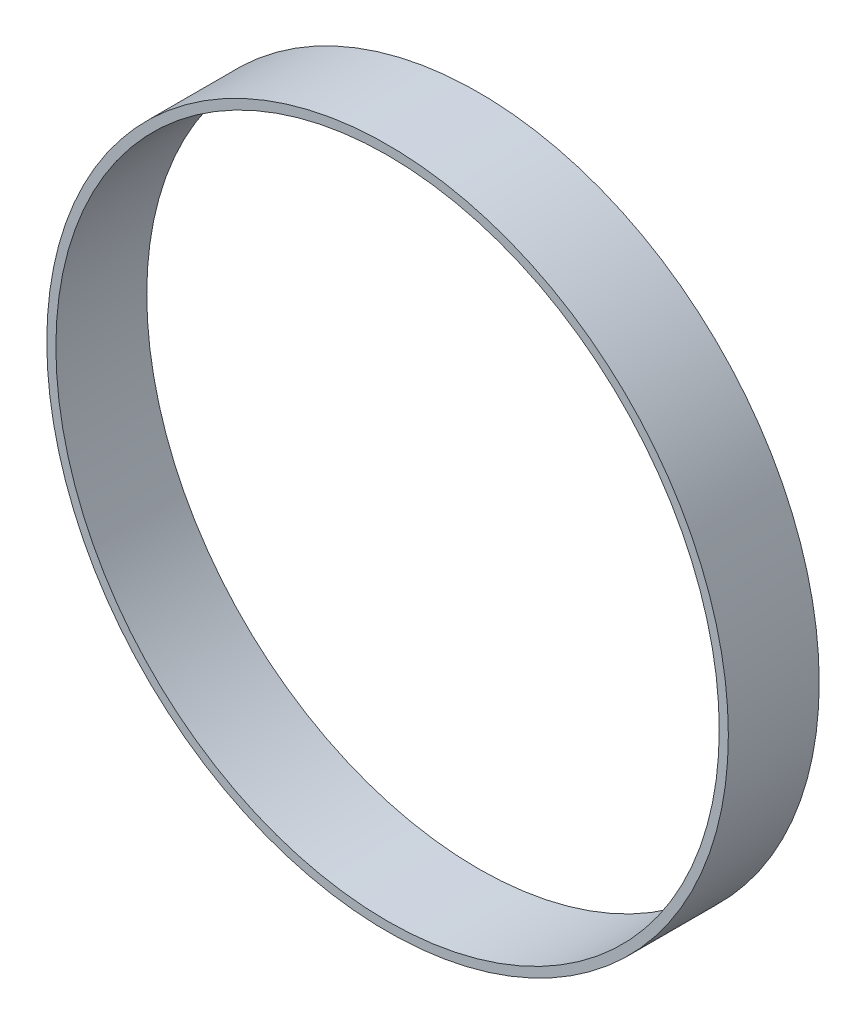
ISO-10303-21;
HEADER;
FILE_DESCRIPTION(('STEP AP214'),'2;1');
FILE_NAME('part.step','',(''),(''),'','','');
FILE_SCHEMA(('AUTOMOTIVE_DESIGN { 1 0 10303 214 1 1 1 1 }'));
ENDSEC;
DATA;
#1=APPLICATION_CONTEXT('core data for automotive mechanical design processes');
#2=APPLICATION_PROTOCOL_DEFINITION('international standard','automotive_design',2000,#1);
#3=PRODUCT_CONTEXT('',#1,'mechanical');
#4=PRODUCT('Part','Part','',(#3));
#5=PRODUCT_RELATED_PRODUCT_CATEGORY('part','',(#4));
#6=PRODUCT_DEFINITION_FORMATION('','',#4);
#7=PRODUCT_DEFINITION_CONTEXT('part definition',#1,'design');
#8=PRODUCT_DEFINITION('design','',#6,#7);
#9=PRODUCT_DEFINITION_SHAPE('','',#8);
#10=(LENGTH_UNIT() NAMED_UNIT(*) SI_UNIT(.MILLI.,.METRE.));
#11=(NAMED_UNIT(*) PLANE_ANGLE_UNIT() SI_UNIT($,.RADIAN.));
#12=(NAMED_UNIT(*) SI_UNIT($,.STERADIAN.) SOLID_ANGLE_UNIT());
#13=UNCERTAINTY_MEASURE_WITH_UNIT(LENGTH_MEASURE(1.E-05),#10,'distance_accuracy_value','');
#14=(GEOMETRIC_REPRESENTATION_CONTEXT(3) GLOBAL_UNCERTAINTY_ASSIGNED_CONTEXT((#13)) GLOBAL_UNIT_ASSIGNED_CONTEXT((#10,
#11,#12)) REPRESENTATION_CONTEXT('',''));
#15=CARTESIAN_POINT('',(0.,0.,0.));
#16=DIRECTION('',(0.,0.,1.));
#17=DIRECTION('',(1.,0.,0.));
#18=AXIS2_PLACEMENT_3D('',#15,#16,#17);
#19=CARTESIAN_POINT('',(0.,0.,-10.));
#20=DIRECTION('',(0.,0.,1.));
#21=DIRECTION('',(1.,0.,0.));
#22=AXIS2_PLACEMENT_3D('',#19,#20,#21);
#23=CYLINDRICAL_SURFACE('',#22,75.);
#24=CARTESIAN_POINT('',(0.,0.,-10.));
#25=DIRECTION('',(0.,0.,1.));
#26=DIRECTION('',(1.,0.,0.));
#27=AXIS2_PLACEMENT_3D('',#24,#25,#26);
#28=CIRCLE('',#27,75.);
#29=CARTESIAN_POINT('',(75.,0.,-10.));
#30=VERTEX_POINT('',#29);
#31=EDGE_CURVE('E10',#30,#30,#28,.T.);
#32=ORIENTED_EDGE('',*,*,#31,.T.);
#33=EDGE_LOOP('',(#32));
#34=FACE_BOUND('',#33,.T.);
#35=CARTESIAN_POINT('',(0.,0.,10.));
#36=DIRECTION('',(0.,0.,1.));
#37=DIRECTION('',(1.,0.,0.));
#38=AXIS2_PLACEMENT_3D('',#35,#36,#37);
#39=CIRCLE('',#38,75.);
#40=CARTESIAN_POINT('',(75.,0.,10.));
#41=VERTEX_POINT('',#40);
#42=EDGE_CURVE('E41',#41,#41,#39,.T.);
#43=ORIENTED_EDGE('',*,*,#42,.F.);
#44=EDGE_LOOP('',(#43));
#45=FACE_BOUND('',#44,.T.);
#46=ADVANCED_FACE('F31',(#34,#45),#23,.T.);
#47=CARTESIAN_POINT('',(0.,0.,-10.));
#48=DIRECTION('',(0.,0.,1.));
#49=DIRECTION('',(1.,0.,0.));
#50=AXIS2_PLACEMENT_3D('',#47,#48,#49);
#51=PLANE('',#50);
#52=CARTESIAN_POINT('',(0.,0.,-10.));
#53=DIRECTION('',(0.,0.,1.));
#54=DIRECTION('',(1.,0.,0.));
#55=AXIS2_PLACEMENT_3D('',#52,#53,#54);
#56=CIRCLE('',#55,73.);
#57=CARTESIAN_POINT('',(73.,0.,-10.));
#58=VERTEX_POINT('',#57);
#59=EDGE_CURVE('E37',#58,#58,#56,.T.);
#60=ORIENTED_EDGE('',*,*,#59,.T.);
#61=EDGE_LOOP('',(#60));
#62=FACE_BOUND('',#61,.T.);
#63=ORIENTED_EDGE('',*,*,#31,.F.);
#64=EDGE_LOOP('',(#63));
#65=FACE_BOUND('',#64,.T.);
#66=ADVANCED_FACE('F60',(#62,#65),#51,.F.);
#67=CARTESIAN_POINT('',(0.,0.,-10.));
#68=DIRECTION('',(0.,0.,1.));
#69=DIRECTION('',(1.,0.,0.));
#70=AXIS2_PLACEMENT_3D('',#67,#68,#69);
#71=CYLINDRICAL_SURFACE('',#70,73.);
#72=ORIENTED_EDGE('',*,*,#59,.F.);
#73=EDGE_LOOP('',(#72));
#74=FACE_BOUND('',#73,.T.);
#75=CARTESIAN_POINT('',(0.,0.,10.));
#76=DIRECTION('',(0.,0.,1.));
#77=DIRECTION('',(1.,0.,0.));
#78=AXIS2_PLACEMENT_3D('',#75,#76,#77);
#79=CIRCLE('',#78,73.);
#80=CARTESIAN_POINT('',(73.,0.,10.));
#81=VERTEX_POINT('',#80);
#82=EDGE_CURVE('E45',#81,#81,#79,.T.);
#83=ORIENTED_EDGE('',*,*,#82,.T.);
#84=EDGE_LOOP('',(#83));
#85=FACE_BOUND('',#84,.T.);
#86=ADVANCED_FACE('F51',(#74,#85),#71,.F.);
#87=CARTESIAN_POINT('',(0.,0.,10.));
#88=DIRECTION('',(0.,0.,1.));
#89=DIRECTION('',(1.,0.,0.));
#90=AXIS2_PLACEMENT_3D('',#87,#88,#89);
#91=PLANE('',#90);
#92=ORIENTED_EDGE('',*,*,#42,.T.);
#93=EDGE_LOOP('',(#92));
#94=FACE_BOUND('',#93,.T.);
#95=ORIENTED_EDGE('',*,*,#82,.F.);
#96=EDGE_LOOP('',(#95));
#97=FACE_BOUND('',#96,.T.);
#98=ADVANCED_FACE('F53',(#94,#97),#91,.T.);
#99=CLOSED_SHELL('',(#46,#66,#86,#98));
#100=MANIFOLD_SOLID_BREP('B2',#99);
#101=ADVANCED_BREP_SHAPE_REPRESENTATION('',(#18,#100),#14);
#102=SHAPE_DEFINITION_REPRESENTATION(#9,#101);
ENDSEC;
END-ISO-10303-21;
